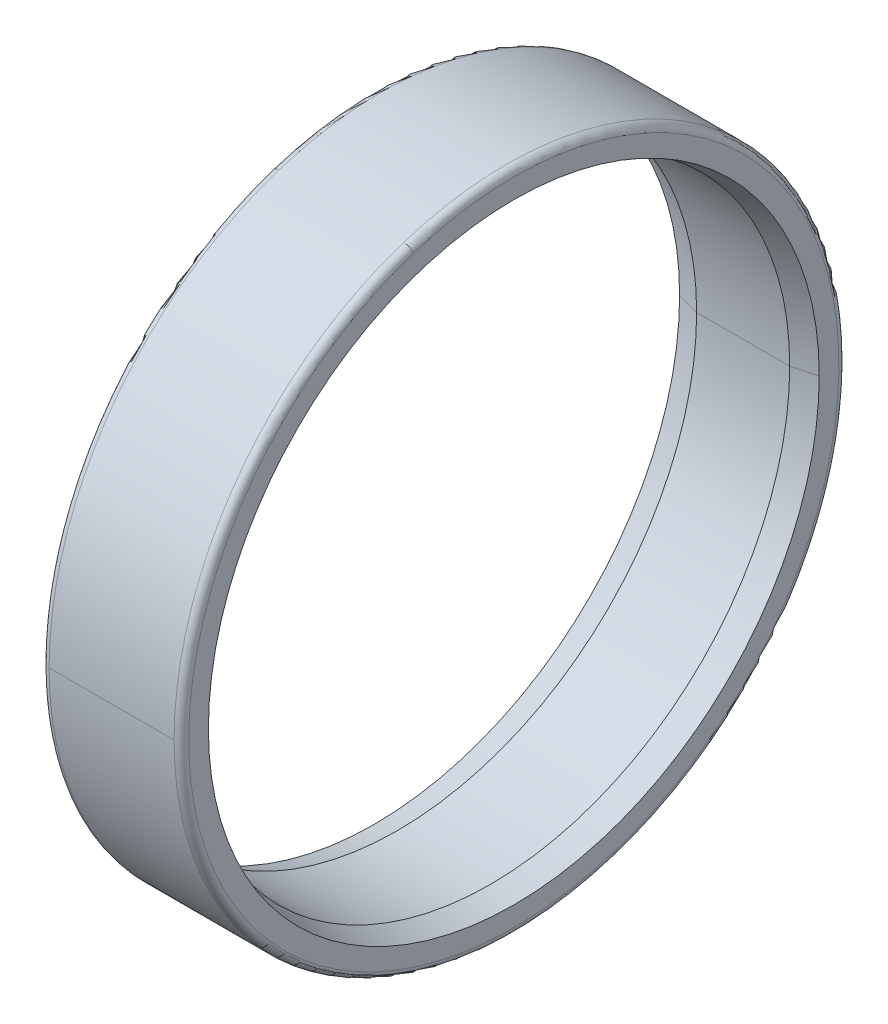
ISO-10303-21;
HEADER;
FILE_DESCRIPTION(('STEP AP214'),'2;1');
FILE_NAME('part.step','',(''),(''),'','','');
FILE_SCHEMA(('AUTOMOTIVE_DESIGN { 1 0 10303 214 1 1 1 1 }'));
ENDSEC;
DATA;
#1=APPLICATION_CONTEXT('core data for automotive mechanical design processes');
#2=APPLICATION_PROTOCOL_DEFINITION('international standard','automotive_design',2000,#1);
#3=PRODUCT_CONTEXT('',#1,'mechanical');
#4=PRODUCT('Part','Part','',(#3));
#5=PRODUCT_RELATED_PRODUCT_CATEGORY('part','',(#4));
#6=PRODUCT_DEFINITION_FORMATION('','',#4);
#7=PRODUCT_DEFINITION_CONTEXT('part definition',#1,'design');
#8=PRODUCT_DEFINITION('design','',#6,#7);
#9=PRODUCT_DEFINITION_SHAPE('','',#8);
#10=(LENGTH_UNIT() NAMED_UNIT(*) SI_UNIT(.MILLI.,.METRE.));
#11=(NAMED_UNIT(*) PLANE_ANGLE_UNIT() SI_UNIT($,.RADIAN.));
#12=(NAMED_UNIT(*) SI_UNIT($,.STERADIAN.) SOLID_ANGLE_UNIT());
#13=UNCERTAINTY_MEASURE_WITH_UNIT(LENGTH_MEASURE(1.E-05),#10,'distance_accuracy_value','');
#14=(GEOMETRIC_REPRESENTATION_CONTEXT(3) GLOBAL_UNCERTAINTY_ASSIGNED_CONTEXT((#13)) GLOBAL_UNIT_ASSIGNED_CONTEXT((#10,
#11,#12)) REPRESENTATION_CONTEXT('',''));
#15=CARTESIAN_POINT('',(0.,0.,0.));
#16=DIRECTION('',(0.,0.,1.));
#17=DIRECTION('',(1.,0.,0.));
#18=AXIS2_PLACEMENT_3D('',#15,#16,#17);
#19=CARTESIAN_POINT('',(0.,48.9,0.));
#20=DIRECTION('',(-1.,0.,0.));
#21=DIRECTION('',(0.,0.,1.));
#22=AXIS2_PLACEMENT_3D('',#19,#20,#21);
#23=PLANE('',#22);
#24=CARTESIAN_POINT('',(0.,0.,0.));
#25=DIRECTION('',(1.,0.,0.));
#26=DIRECTION('',(0.,0.,-1.));
#27=AXIS2_PLACEMENT_3D('',#24,#25,#26);
#28=CIRCLE('',#27,45.937822173509);
#29=CARTESIAN_POINT('',(0.,0.,-45.937822173509));
#30=VERTEX_POINT('',#29);
#31=CARTESIAN_POINT('',(0.,0.,45.937822173509));
#32=VERTEX_POINT('',#31);
#33=EDGE_CURVE('E11',#30,#32,#28,.T.);
#34=ORIENTED_EDGE('',*,*,#33,.T.);
#35=CARTESIAN_POINT('',(0.,0.,0.));
#36=DIRECTION('',(1.,0.,0.));
#37=DIRECTION('',(0.,0.,-1.));
#38=AXIS2_PLACEMENT_3D('',#35,#36,#37);
#39=CIRCLE('',#38,45.937822173509);
#40=EDGE_CURVE('E26',#32,#30,#39,.T.);
#41=ORIENTED_EDGE('',*,*,#40,.T.);
#42=EDGE_LOOP('',(#34,#41));
#43=FACE_BOUND('',#42,.T.);
#44=CARTESIAN_POINT('',(0.,46.506663646833,15.1109310249349));
#45=CARTESIAN_POINT('',(0.,46.2594275083766,15.8719005426773));
#46=CARTESIAN_POINT('',(0.,45.9934832526356,16.626789906107));
#47=CARTESIAN_POINT('',(0.,45.4248889301714,18.1226162391177));
#48=CARTESIAN_POINT('',(0.,45.1222388634484,18.8635532086987));
#49=CARTESIAN_POINT('',(0.,44.4809433426075,20.3296826687885));
#50=CARTESIAN_POINT('',(0.,44.1422978884898,21.0548751592974));
#51=CARTESIAN_POINT('',(0.,43.4298324265688,22.4877705123014));
#52=CARTESIAN_POINT('',(0.,43.0560124187656,23.1954733747965));
#53=CARTESIAN_POINT('',(0.,42.274097072954,24.5916840436056));
#54=CARTESIAN_POINT('',(0.,41.8660017349455,25.2801918499195));
#55=CARTESIAN_POINT('',(0.,41.0165192256346,26.6363538674045));
#56=CARTESIAN_POINT('',(0.,40.5751320543322,27.3040080785755));
#57=CARTESIAN_POINT('',(0.,39.660129122463,28.616854431685));
#58=CARTESIAN_POINT('',(0.,39.1865133618963,29.2620465736235));
#59=CARTESIAN_POINT('',(0.,38.2081942591603,30.5284144736971));
#60=CARTESIAN_POINT('',(0.,37.703490916991,31.1495902318321));
#61=CARTESIAN_POINT('',(0.,36.664212518692,32.3664288948598));
#62=CARTESIAN_POINT('',(0.,36.1296374625623,32.9620917997525));
#63=CARTESIAN_POINT('',(0.,35.0319034763291,34.1264697528883));
#64=CARTESIAN_POINT('',(0.,34.4687445462256,34.6951848011313));
#65=CARTESIAN_POINT('',(0.,33.3151995107377,35.8042969564141));
#66=CARTESIAN_POINT('',(0.,32.7248134053533,36.3446940634539));
#67=CARTESIAN_POINT('',(0.,31.5182363112762,37.3958684724169));
#68=CARTESIAN_POINT('',(0.,30.9020453225836,37.90664577434));
#69=CARTESIAN_POINT('',(0.,29.6453429199182,38.8973500657968));
#70=CARTESIAN_POINT('',(0.,29.0048315059454,39.3772770553306));
#71=CARTESIAN_POINT('',(0.,27.7010313008277,40.3051245358579));
#72=CARTESIAN_POINT('',(0.,27.0377425096827,40.7530450268514));
#73=CARTESIAN_POINT('',(0.,25.6899854710132,41.6158004306014));
#74=CARTESIAN_POINT('',(0.,25.0055172234886,42.0306353433578));
#75=CARTESIAN_POINT('',(0.,23.6170502160211,42.8262202169936));
#76=CARTESIAN_POINT('',(0.,22.9130514560782,43.206970177873));
#77=CARTESIAN_POINT('',(0.,21.4872194184496,43.9334678877493));
#78=CARTESIAN_POINT('',(0.,20.7653861407639,44.2792156367462));
#79=CARTESIAN_POINT('',(0.,19.3056240272408,44.9348759862461));
#80=CARTESIAN_POINT('',(0.,18.5676951914034,45.2447885867492));
#81=CARTESIAN_POINT('',(0.,17.0775196967775,45.8280320326618));
#82=CARTESIAN_POINT('',(0.,16.3252730379889,46.1013628780713));
#83=CARTESIAN_POINT('',(0.,14.8082741255506,46.6107843358492));
#84=CARTESIAN_POINT('',(0.,14.0435218719008,46.8468749482176));
#85=CARTESIAN_POINT('',(0.,12.5033541249036,47.2812471769491));
#86=CARTESIAN_POINT('',(0.,11.7279386315561,47.4795287933121));
#87=CARTESIAN_POINT('',(0.,10.1683124490052,47.8378053522515));
#88=CARTESIAN_POINT('',(0.,9.3841017598018,47.9978002948279));
#89=CARTESIAN_POINT('',(0.,7.80877441777818,48.2791180643635));
#90=CARTESIAN_POINT('',(0.,7.01765776495794,48.4004408913227));
#91=CARTESIAN_POINT('',(0.,5.4304243650109,48.6041221523071));
#92=CARTESIAN_POINT('',(0.,4.63430761788408,48.6864805863324));
#93=CARTESIAN_POINT('',(0.,3.03899194429929,48.8120346527676));
#94=CARTESIAN_POINT('',(0.,2.23979301784132,48.8552302851775));
#95=CARTESIAN_POINT('',(0.,0.640238325809615,48.9023546863202));
#96=CARTESIAN_POINT('',(0.,-0.160117439764109,48.9062834550529));
#97=CARTESIAN_POINT('',(0.,-1.76005768288518,48.8748646640931));
#98=CARTESIAN_POINT('',(0.,-2.55964216043252,48.8395171044005));
#99=CARTESIAN_POINT('',(0.,-4.15611355845907,48.7296308119576));
#100=CARTESIAN_POINT('',(0.,-4.95300047893828,48.6550920792072));
#101=CARTESIAN_POINT('',(0.,-6.54215699243808,48.4670030109846));
#102=CARTESIAN_POINT('',(0.,-7.33442658545868,48.3534526755124));
#103=CARTESIAN_POINT('',(0.,-8.91243979719704,48.08761395455));
#104=CARTESIAN_POINT('',(0.,-9.6981834159148,47.9353255690599));
#105=CARTESIAN_POINT('',(0.,-11.261251753847,47.5923776241214));
#106=CARTESIAN_POINT('',(0.,-12.0385764730614,47.401718064673));
#107=CARTESIAN_POINT('',(0.,-13.5829343686528,46.9824870873964));
#108=CARTESIAN_POINT('',(0.,-14.3499675450297,46.7539156695682));
#109=CARTESIAN_POINT('',(0.,-15.87189450484,46.2594116240979));
#110=CARTESIAN_POINT('',(0.,-16.6267882882733,45.9934789964559));
#111=CARTESIAN_POINT('',(0.,-18.1226178569512,45.4248931863511));
#112=CARTESIAN_POINT('',(0.,-18.8635536421958,45.1222400038883));
#113=CARTESIAN_POINT('',(0.,-20.3296822352912,44.4809422021677));
#114=CARTESIAN_POINT('',(0.,-21.0548750431421,44.1422975829099));
#115=CARTESIAN_POINT('',(0.,-22.4877706284565,43.4298327321488));
#116=CARTESIAN_POINT('',(0.,-23.1954734059202,43.0560125006456));
#117=CARTESIAN_POINT('',(0.,-24.5916840124818,42.2740969910741));
#118=CARTESIAN_POINT('',(0.,-25.2801918415799,41.8660017130059));
#119=CARTESIAN_POINT('',(0.,-26.6363538757439,41.0165192475743));
#120=CARTESIAN_POINT('',(0.,-27.30400808081,40.575132060211));
#121=CARTESIAN_POINT('',(0.,-28.6168544294503,39.6601291165844));
#122=CARTESIAN_POINT('',(0.,-29.2620465730247,39.1865133603212));
#123=CARTESIAN_POINT('',(0.,-30.5284144742958,38.2081942607355));
#124=CARTESIAN_POINT('',(0.,-31.1495902319925,37.7034909174131));
#125=CARTESIAN_POINT('',(0.,-32.3664288946993,36.66421251827));
#126=CARTESIAN_POINT('',(0.,-32.9620917997095,36.1296374624493));
#127=CARTESIAN_POINT('',(0.,-34.1264697529312,35.0319034764423));
#128=CARTESIAN_POINT('',(0.,-34.6951848011427,34.468744546256));
#129=CARTESIAN_POINT('',(0.,-35.8042969564025,33.3151995107074));
#130=CARTESIAN_POINT('',(0.,-36.3446940634508,32.7248134053452));
#131=CARTESIAN_POINT('',(0.,-37.3958684724199,31.5182363112844));
#132=CARTESIAN_POINT('',(0.,-37.9066457743408,30.9020453225859));
#133=CARTESIAN_POINT('',(0.,-38.8973500657959,29.6453429199161));
#134=CARTESIAN_POINT('',(0.,-39.3772770553303,29.0048315059449));
#135=CARTESIAN_POINT('',(0.,-40.305124535858,27.7010313008283));
#136=CARTESIAN_POINT('',(0.,-40.7530450268514,27.0377425096829));
#137=CARTESIAN_POINT('',(0.,-41.6158004306012,25.6899854710131));
#138=CARTESIAN_POINT('',(0.,-42.0306353433577,25.0055172234886));
#139=CARTESIAN_POINT('',(0.,-42.8262202169936,23.6170502160212));
#140=CARTESIAN_POINT('',(0.,-43.206970177873,22.9130514560783));
#141=CARTESIAN_POINT('',(0.,-43.9334678877493,21.4872194184497));
#142=CARTESIAN_POINT('',(0.,-44.2792156367461,20.765386140764));
#143=CARTESIAN_POINT('',(0.,-44.9348759862461,19.3056240272409));
#144=CARTESIAN_POINT('',(0.,-45.2447885867493,18.5676951914035));
#145=CARTESIAN_POINT('',(0.,-45.8280320326616,17.0775196967776));
#146=CARTESIAN_POINT('',(0.,-46.1013628780706,16.3252730379892));
#147=CARTESIAN_POINT('',(0.,-46.6107843358498,14.8082741255505));
#148=CARTESIAN_POINT('',(0.,-46.8468749482198,14.0435218719003));
#149=CARTESIAN_POINT('',(0.,-47.2812471769468,12.5033541249043));
#150=CARTESIAN_POINT('',(0.,-47.4795287933037,11.7279386315584));
#151=CARTESIAN_POINT('',(0.,-47.8378053522599,10.168312449003));
#152=CARTESIAN_POINT('',(0.,-47.9978002948592,9.38410175979341));
#153=CARTESIAN_POINT('',(0.,-48.2791180643322,7.80877441778678));
#154=CARTESIAN_POINT('',(0.,-48.4004408912059,7.01765776498976));
#155=CARTESIAN_POINT('',(0.,-48.6041221524239,5.43042436497932));
#156=CARTESIAN_POINT('',(0.,-48.6864805867681,4.63430761776589));
#157=CARTESIAN_POINT('',(0.,-48.8120346523318,3.03899194441768));
#158=CARTESIAN_POINT('',(0.,-48.8552302835512,2.23979301828289));
#159=CARTESIAN_POINT('',(0.,-48.9023546879465,0.640238325368244));
#160=CARTESIAN_POINT('',(0.,-48.9062834611223,-0.160117441411617));
#161=CARTESIAN_POINT('',(0.,-48.8748646580236,-1.76005768123747));
#162=CARTESIAN_POINT('',(0.,-48.8395170817491,-2.55964215428347));
#163=CARTESIAN_POINT('',(0.,-48.729630834609,-4.15611356460791));
#164=CARTESIAN_POINT('',(0.,-48.6550921637435,-4.95300050188636));
#165=CARTESIAN_POINT('',(0.,-48.4670029264483,-6.54215696948977));
#166=CARTESIAN_POINT('',(0.,-48.3534523600187,-7.33442649981472));
#167=CARTESIAN_POINT('',(0.,-48.0876142700437,-8.91243988284074));
#168=CARTESIAN_POINT('',(0.,-47.9353267464985,-9.69818373554182));
#169=CARTESIAN_POINT('',(0.,-47.5923764466829,-11.2612514342197));
#170=CARTESIAN_POINT('',(0.,-47.4017136704126,-12.0385752801966));
#171=CARTESIAN_POINT('',(0.,-46.9824914816568,-13.5829355615174));
#172=CARTESIAN_POINT('',(0.,-46.7539320691713,-14.3499719968614));
#173=CARTESIAN_POINT('',(0.,-46.5066636468331,-15.1109310249348));
#174=B_SPLINE_CURVE_WITH_KNOTS('',3,(#44,#45,#46,#47,#48,#49,#50,#51,#52,#53,#54,#55,#56,#57,
#58,#59,#60,#61,#62,#63,#64,#65,#66,#67,#68,#69,#70,#71,#72,#73,#74,#75,#76,#77,#78,#79,#80,#81,
#82,#83,#84,#85,#86,#87,#88,#89,#90,#91,#92,#93,#94,#95,#96,#97,#98,#99,#100,#101,#102,#103,
#104,#105,#106,#107,#108,#109,#110,#111,#112,#113,#114,#115,#116,#117,#118,#119,#120,#121,#122,
#123,#124,#125,#126,#127,#128,#129,#130,#131,#132,#133,#134,#135,#136,#137,#138,#139,#140,#141,
#142,#143,#144,#145,#146,#147,#148,#149,#150,#151,#152,#153,#154,#155,#156,#157,#158,#159,#160,
#161,#162,#163,#164,#165,#166,#167,#168,#169,#170,#171,#172,#173),.UNSPECIFIED.,.F.,.F.,(4,2,2,
2,2,2,2,2,2,2,2,2,2,2,2,2,2,2,2,2,2,2,2,2,2,2,2,2,2,2,2,2,2,2,2,2,2,2,2,2,2,2,2,2,2,2,2,2,2,2,2,
2,2,2,2,2,2,2,2,2,2,2,2,2,4),(0.,2.40013214954082,4.80026429908164,7.20039644862246,
9.60052859816327,12.0006607477041,14.4007928972449,16.8009250467857,19.2010571963266,
21.6011893458674,24.0013214954082,26.401453644949,28.8015857944898,31.2017179440306,
33.6018500935715,36.0019822431123,38.4021143926531,40.8022465421939,43.2023786917348,
45.6025108412756,48.0026429908164,50.4027751403572,52.802907289898,55.2030394394388,
57.6031715889797,60.0033037385205,62.4034358880613,64.8035680376021,67.2037001871429,
69.6038323366838,72.0039644862246,74.4040966357654,76.8042287853062,79.204360934847,
81.6044930843878,84.0046252339286,86.4047573834695,88.8048895330103,91.2050216825511,
93.6051538320919,96.0052859816328,98.4054181311736,100.805550280714,103.205682430255,
105.605814579796,108.005946729337,110.406078878878,112.806211028418,115.206343177959,
117.6064753275,120.006607477041,122.406739626582,124.806871776123,127.207003925663,
129.607136075204,132.007268224745,134.407400374286,136.807532523827,139.207664673368,
141.607796822908,144.007928972449,146.40806112199,148.808193271531,151.208325421072,
153.608457570612),.UNSPECIFIED.);
#175=CARTESIAN_POINT('',(0.,46.506663646833,15.1109310249349));
#176=VERTEX_POINT('',#175);
#177=CARTESIAN_POINT('',(0.,-46.506663646833,-15.1109310249349));
#178=VERTEX_POINT('',#177);
#179=EDGE_CURVE('E213',#176,#178,#174,.T.);
#180=ORIENTED_EDGE('',*,*,#179,.F.);
#181=CARTESIAN_POINT('',(0.,-46.506663646833,-15.1109310249349));
#182=CARTESIAN_POINT('',(0.,-46.2594275083766,-15.8719005426773));
#183=CARTESIAN_POINT('',(0.,-45.9934832526356,-16.626789906107));
#184=CARTESIAN_POINT('',(0.,-45.4248889301714,-18.1226162391177));
#185=CARTESIAN_POINT('',(0.,-45.1222388634484,-18.8635532086987));
#186=CARTESIAN_POINT('',(0.,-44.4809433426075,-20.3296826687885));
#187=CARTESIAN_POINT('',(0.,-44.1422978884898,-21.0548751592974));
#188=CARTESIAN_POINT('',(0.,-43.4298324265688,-22.4877705123014));
#189=CARTESIAN_POINT('',(0.,-43.0560124187656,-23.1954733747965));
#190=CARTESIAN_POINT('',(0.,-42.274097072954,-24.5916840436056));
#191=CARTESIAN_POINT('',(0.,-41.8660017349455,-25.2801918499195));
#192=CARTESIAN_POINT('',(0.,-41.0165192256346,-26.6363538674044));
#193=CARTESIAN_POINT('',(0.,-40.5751320543322,-27.3040080785754));
#194=CARTESIAN_POINT('',(0.,-39.6601291224631,-28.616854431685));
#195=CARTESIAN_POINT('',(0.,-39.1865133618963,-29.2620465736235));
#196=CARTESIAN_POINT('',(0.,-38.2081942591603,-30.5284144736971));
#197=CARTESIAN_POINT('',(0.,-37.703490916991,-31.1495902318321));
#198=CARTESIAN_POINT('',(0.,-36.6642125186921,-32.3664288948598));
#199=CARTESIAN_POINT('',(0.,-36.1296374625624,-32.9620917997525));
#200=CARTESIAN_POINT('',(0.,-35.0319034763291,-34.1264697528883));
#201=CARTESIAN_POINT('',(0.,-34.4687445462256,-34.6951848011313));
#202=CARTESIAN_POINT('',(0.,-33.3151995107377,-35.8042969564141));
#203=CARTESIAN_POINT('',(0.,-32.7248134053533,-36.3446940634539));
#204=CARTESIAN_POINT('',(0.,-31.5182363112763,-37.3958684724168));
#205=CARTESIAN_POINT('',(0.,-30.9020453225836,-37.90664577434));
#206=CARTESIAN_POINT('',(0.,-29.6453429199182,-38.8973500657968));
#207=CARTESIAN_POINT('',(0.,-29.0048315059455,-39.3772770553305));
#208=CARTESIAN_POINT('',(0.,-27.7010313008277,-40.3051245358578));
#209=CARTESIAN_POINT('',(0.,-27.0377425096828,-40.7530450268514));
#210=CARTESIAN_POINT('',(0.,-25.6899854710132,-41.6158004306013));
#211=CARTESIAN_POINT('',(0.,-25.0055172234886,-42.0306353433578));
#212=CARTESIAN_POINT('',(0.,-23.6170502160211,-42.8262202169936));
#213=CARTESIAN_POINT('',(0.,-22.9130514560782,-43.206970177873));
#214=CARTESIAN_POINT('',(0.,-21.4872194184496,-43.9334678877493));
#215=CARTESIAN_POINT('',(0.,-20.7653861407639,-44.2792156367462));
#216=CARTESIAN_POINT('',(0.,-19.3056240272408,-44.9348759862461));
#217=CARTESIAN_POINT('',(0.,-18.5676951914035,-45.2447885867492));
#218=CARTESIAN_POINT('',(0.,-17.0775196967775,-45.8280320326618));
#219=CARTESIAN_POINT('',(0.,-16.3252730379889,-46.1013628780713));
#220=CARTESIAN_POINT('',(0.,-14.8082741255506,-46.6107843358492));
#221=CARTESIAN_POINT('',(0.,-14.0435218719008,-46.8468749482176));
#222=CARTESIAN_POINT('',(0.,-12.5033541249036,-47.2812471769491));
#223=CARTESIAN_POINT('',(0.,-11.7279386315561,-47.4795287933121));
#224=CARTESIAN_POINT('',(0.,-10.1683124490052,-47.8378053522515));
#225=CARTESIAN_POINT('',(0.,-9.38410175980185,-47.9978002948279));
#226=CARTESIAN_POINT('',(0.,-7.80877441777823,-48.2791180643635));
#227=CARTESIAN_POINT('',(0.,-7.01765776495799,-48.4004408913227));
#228=CARTESIAN_POINT('',(0.,-5.43042436501094,-48.6041221523071));
#229=CARTESIAN_POINT('',(0.,-4.63430761788413,-48.6864805863324));
#230=CARTESIAN_POINT('',(0.,-3.03899194429934,-48.8120346527675));
#231=CARTESIAN_POINT('',(0.,-2.23979301784136,-48.8552302851775));
#232=CARTESIAN_POINT('',(0.,-0.640238325809655,-48.9023546863202));
#233=CARTESIAN_POINT('',(0.,0.160117439764075,-48.9062834550529));
#234=CARTESIAN_POINT('',(0.,1.76005768288514,-48.8748646640931));
#235=CARTESIAN_POINT('',(0.,2.55964216043248,-48.8395171044005));
#236=CARTESIAN_POINT('',(0.,4.15611355845903,-48.7296308119576));
#237=CARTESIAN_POINT('',(0.,4.95300047893823,-48.6550920792072));
#238=CARTESIAN_POINT('',(0.,6.54215699243802,-48.4670030109846));
#239=CARTESIAN_POINT('',(0.,7.3344265854586,-48.3534526755124));
#240=CARTESIAN_POINT('',(0.,8.91243979719696,-48.08761395455));
#241=CARTESIAN_POINT('',(0.,9.69818341591474,-47.9353255690599));
#242=CARTESIAN_POINT('',(0.,11.261251753847,-47.5923776241214));
#243=CARTESIAN_POINT('',(0.,12.0385764730614,-47.401718064673));
#244=CARTESIAN_POINT('',(0.,13.5829343686527,-46.9824870873964));
#245=CARTESIAN_POINT('',(0.,14.3499675450297,-46.7539156695682));
#246=CARTESIAN_POINT('',(0.,15.8718945048399,-46.2594116240979));
#247=CARTESIAN_POINT('',(0.,16.6267882882733,-45.993478996456));
#248=CARTESIAN_POINT('',(0.,18.1226178569512,-45.4248931863511));
#249=CARTESIAN_POINT('',(0.,18.8635536421957,-45.1222400038883));
#250=CARTESIAN_POINT('',(0.,20.3296822352912,-44.4809422021677));
#251=CARTESIAN_POINT('',(0.,21.054875043142,-44.1422975829099));
#252=CARTESIAN_POINT('',(0.,22.4877706284565,-43.4298327321488));
#253=CARTESIAN_POINT('',(0.,23.1954734059201,-43.0560125006456));
#254=CARTESIAN_POINT('',(0.,24.5916840124818,-42.2740969910741));
#255=CARTESIAN_POINT('',(0.,25.2801918415798,-41.8660017130059));
#256=CARTESIAN_POINT('',(0.,26.6363538757439,-41.0165192475744));
#257=CARTESIAN_POINT('',(0.,27.3040080808099,-40.575132060211));
#258=CARTESIAN_POINT('',(0.,28.6168544294503,-39.6601291165844));
#259=CARTESIAN_POINT('',(0.,29.2620465730247,-39.1865133603212));
#260=CARTESIAN_POINT('',(0.,30.5284144742957,-38.2081942607356));
#261=CARTESIAN_POINT('',(0.,31.1495902319924,-37.7034909174132));
#262=CARTESIAN_POINT('',(0.,32.3664288946993,-36.6642125182701));
#263=CARTESIAN_POINT('',(0.,32.9620917997094,-36.1296374624494));
#264=CARTESIAN_POINT('',(0.,34.1264697529311,-35.0319034764423));
#265=CARTESIAN_POINT('',(0.,34.6951848011427,-34.468744546256));
#266=CARTESIAN_POINT('',(0.,35.8042969564025,-33.3151995107075));
#267=CARTESIAN_POINT('',(0.,36.3446940634507,-32.7248134053453));
#268=CARTESIAN_POINT('',(0.,37.3958684724198,-31.5182363112845));
#269=CARTESIAN_POINT('',(0.,37.9066457743407,-30.9020453225859));
#270=CARTESIAN_POINT('',(0.,38.8973500657959,-29.6453429199162));
#271=CARTESIAN_POINT('',(0.,39.3772770553302,-29.004831505945));
#272=CARTESIAN_POINT('',(0.,40.305124535858,-27.7010313008284));
#273=CARTESIAN_POINT('',(0.,40.7530450268514,-27.037742509683));
#274=CARTESIAN_POINT('',(0.,41.6158004306012,-25.6899854710132));
#275=CARTESIAN_POINT('',(0.,42.0306353433577,-25.0055172234887));
#276=CARTESIAN_POINT('',(0.,42.8262202169935,-23.6170502160213));
#277=CARTESIAN_POINT('',(0.,43.2069701778729,-22.9130514560783));
#278=CARTESIAN_POINT('',(0.,43.9334678877492,-21.4872194184497));
#279=CARTESIAN_POINT('',(0.,44.2792156367461,-20.765386140764));
#280=CARTESIAN_POINT('',(0.,44.9348759862461,-19.3056240272409));
#281=CARTESIAN_POINT('',(0.,45.2447885867493,-18.5676951914035));
#282=CARTESIAN_POINT('',(0.,45.8280320326615,-17.0775196967777));
#283=CARTESIAN_POINT('',(0.,46.1013628780706,-16.3252730379892));
#284=CARTESIAN_POINT('',(0.,46.6107843358497,-14.8082741255505));
#285=CARTESIAN_POINT('',(0.,46.8468749482198,-14.0435218719004));
#286=CARTESIAN_POINT('',(0.,47.2812471769468,-12.5033541249043));
#287=CARTESIAN_POINT('',(0.,47.4795287933037,-11.7279386315585));
#288=CARTESIAN_POINT('',(0.,47.8378053522598,-10.1683124490031));
#289=CARTESIAN_POINT('',(0.,47.9978002948591,-9.38410175979348));
#290=CARTESIAN_POINT('',(0.,48.2791180643322,-7.80877441778685));
#291=CARTESIAN_POINT('',(0.,48.4004408912059,-7.01765776498982));
#292=CARTESIAN_POINT('',(0.,48.6041221524239,-5.43042436497938));
#293=CARTESIAN_POINT('',(0.,48.6864805867681,-4.63430761776597));
#294=CARTESIAN_POINT('',(0.,48.8120346523318,-3.03899194441777));
#295=CARTESIAN_POINT('',(0.,48.8552302835512,-2.23979301828299));
#296=CARTESIAN_POINT('',(0.,48.9023546879465,-0.640238325368338));
#297=CARTESIAN_POINT('',(0.,48.9062834611223,0.160117441411524));
#298=CARTESIAN_POINT('',(0.,48.8748646580236,1.76005768123738));
#299=CARTESIAN_POINT('',(0.,48.8395170817491,2.55964215428337));
#300=CARTESIAN_POINT('',(0.,48.7296308346091,4.15611356460782));
#301=CARTESIAN_POINT('',(0.,48.6550921637435,4.95300050188627));
#302=CARTESIAN_POINT('',(0.,48.4670029264483,6.54215696948969));
#303=CARTESIAN_POINT('',(0.,48.3534523600187,7.33442649981466));
#304=CARTESIAN_POINT('',(0.,48.0876142700438,8.91243988284069));
#305=CARTESIAN_POINT('',(0.,47.9353267464985,9.69818373554177));
#306=CARTESIAN_POINT('',(0.,47.5923764466829,11.2612514342197));
#307=CARTESIAN_POINT('',(0.,47.4017136704126,12.0385752801965));
#308=CARTESIAN_POINT('',(0.,46.9824914816568,13.5829355615174));
#309=CARTESIAN_POINT('',(0.,46.7539320691713,14.3499719968614));
#310=CARTESIAN_POINT('',(0.,46.5066636468331,15.1109310249347));
#311=B_SPLINE_CURVE_WITH_KNOTS('',3,(#181,#182,#183,#184,#185,#186,#187,#188,#189,#190,#191,
#192,#193,#194,#195,#196,#197,#198,#199,#200,#201,#202,#203,#204,#205,#206,#207,#208,#209,#210,
#211,#212,#213,#214,#215,#216,#217,#218,#219,#220,#221,#222,#223,#224,#225,#226,#227,#228,#229,
#230,#231,#232,#233,#234,#235,#236,#237,#238,#239,#240,#241,#242,#243,#244,#245,#246,#247,#248,
#249,#250,#251,#252,#253,#254,#255,#256,#257,#258,#259,#260,#261,#262,#263,#264,#265,#266,#267,
#268,#269,#270,#271,#272,#273,#274,#275,#276,#277,#278,#279,#280,#281,#282,#283,#284,#285,#286,
#287,#288,#289,#290,#291,#292,#293,#294,#295,#296,#297,#298,#299,#300,#301,#302,#303,#304,#305,
#306,#307,#308,#309,#310),.UNSPECIFIED.,.F.,.F.,(4,2,2,2,2,2,2,2,2,2,2,2,2,2,2,2,2,2,2,2,2,2,2,
2,2,2,2,2,2,2,2,2,2,2,2,2,2,2,2,2,2,2,2,2,2,2,2,2,2,2,2,2,2,2,2,2,2,2,2,2,2,2,2,2,4),(0.,
2.40013214954082,4.80026429908163,7.20039644862245,9.60052859816327,12.0006607477041,
14.4007928972449,16.8009250467857,19.2010571963265,21.6011893458674,24.0013214954082,
26.401453644949,28.8015857944898,31.2017179440306,33.6018500935714,36.0019822431122,
38.4021143926531,40.8022465421939,43.2023786917347,45.6025108412755,48.0026429908164,
50.4027751403572,52.802907289898,55.2030394394388,57.6031715889796,60.0033037385204,
62.4034358880613,64.8035680376021,67.2037001871429,69.6038323366837,72.0039644862245,
74.4040966357654,76.8042287853062,79.204360934847,81.6044930843878,84.0046252339286,
86.4047573834694,88.8048895330103,91.2050216825511,93.6051538320919,96.0052859816327,
98.4054181311735,100.805550280714,103.205682430255,105.605814579796,108.005946729337,
110.406078878878,112.806211028418,115.206343177959,117.6064753275,120.006607477041,
122.406739626582,124.806871776123,127.207003925663,129.607136075204,132.007268224745,
134.407400374286,136.807532523827,139.207664673367,141.607796822908,144.007928972449,
146.40806112199,148.808193271531,151.208325421072,153.608457570612),.UNSPECIFIED.);
#312=EDGE_CURVE('E314',#178,#176,#311,.T.);
#313=ORIENTED_EDGE('',*,*,#312,.F.);
#314=EDGE_LOOP('',(#180,#313));
#315=FACE_BOUND('',#314,.T.);
#316=ADVANCED_FACE('F17',(#43,#315),#23,.T.);
#317=CARTESIAN_POINT('',(1.10000000000036,0.,0.));
#318=DIRECTION('',(1.,0.,0.));
#319=DIRECTION('',(0.,-0.309016994374947,0.951056516295154));
#320=AXIS2_PLACEMENT_3D('',#317,#318,#319);
#321=TOROIDAL_SURFACE('',#320,48.9,1.10000000000036);
#322=CARTESIAN_POINT('',(1.10000000000036,-46.506663646833,-15.1109310249349));
#323=DIRECTION('',(0.,0.309016994374947,-0.951056516295154));
#324=DIRECTION('',(-3.30039026411189E-13,-0.951056516295154,-0.309016994374947));
#325=AXIS2_PLACEMENT_3D('',#322,#323,#324);
#326=CIRCLE('',#325,1.10000000000036);
#327=CARTESIAN_POINT('',(1.1,-47.552825814758,-15.4508497187475));
#328=VERTEX_POINT('',#327);
#329=EDGE_CURVE('E277',#328,#178,#326,.T.);
#330=ORIENTED_EDGE('',*,*,#329,.T.);
#331=ORIENTED_EDGE('',*,*,#312,.T.);
#332=CARTESIAN_POINT('',(1.10000000000036,46.506663646833,15.1109310249349));
#333=DIRECTION('',(0.,-0.309016994374947,0.951056516295154));
#334=DIRECTION('',(-3.29029732752439E-13,0.951056516295154,0.309016994374947));
#335=AXIS2_PLACEMENT_3D('',#332,#333,#334);
#336=CIRCLE('',#335,1.10000000000036);
#337=CARTESIAN_POINT('',(1.1,47.552825814758,15.4508497187475));
#338=VERTEX_POINT('',#337);
#339=EDGE_CURVE('E273',#338,#176,#336,.T.);
#340=ORIENTED_EDGE('',*,*,#339,.F.);
#341=CARTESIAN_POINT('',(1.1,0.,0.));
#342=DIRECTION('',(1.,0.,0.));
#343=DIRECTION('',(0.,0.,-1.));
#344=AXIS2_PLACEMENT_3D('',#341,#342,#343);
#345=CIRCLE('',#344,50.);
#346=CARTESIAN_POINT('',(1.1,0.,-50.));
#347=VERTEX_POINT('',#346);
#348=EDGE_CURVE('E268',#347,#338,#345,.T.);
#349=ORIENTED_EDGE('',*,*,#348,.F.);
#350=CARTESIAN_POINT('',(1.1,0.,0.));
#351=DIRECTION('',(1.,0.,0.));
#352=DIRECTION('',(0.,0.,-1.));
#353=AXIS2_PLACEMENT_3D('',#350,#351,#352);
#354=CIRCLE('',#353,50.);
#355=EDGE_CURVE('E263',#328,#347,#354,.T.);
#356=ORIENTED_EDGE('',*,*,#355,.F.);
#357=EDGE_LOOP('',(#330,#331,#340,#349,#356));
#358=FACE_BOUND('',#357,.T.);
#359=ADVANCED_FACE('F285',(#358),#321,.T.);
#360=CARTESIAN_POINT('',(10.5,0.,0.));
#361=DIRECTION('',(1.,0.,0.));
#362=DIRECTION('',(0.,1.,0.));
#363=AXIS2_PLACEMENT_3D('',#360,#361,#362);
#364=CYLINDRICAL_SURFACE('',#363,50.);
#365=DIRECTION('',(1.,0.,0.));
#366=VECTOR('',#365,1.);
#367=CARTESIAN_POINT('',(1.09999999999999,0.,50.));
#368=LINE('',#367,#366);
#369=CARTESIAN_POINT('',(1.09999999999999,0.,50.));
#370=VERTEX_POINT('',#369);
#371=CARTESIAN_POINT('',(19.9,0.,50.));
#372=VERTEX_POINT('',#371);
#373=EDGE_CURVE('E258',#370,#372,#368,.T.);
#374=ORIENTED_EDGE('',*,*,#373,.F.);
#375=CARTESIAN_POINT('',(1.1,0.,0.));
#376=DIRECTION('',(1.,0.,0.));
#377=DIRECTION('',(0.,0.,-1.));
#378=AXIS2_PLACEMENT_3D('',#375,#376,#377);
#379=CIRCLE('',#378,50.);
#380=EDGE_CURVE('E253',#370,#328,#379,.T.);
#381=ORIENTED_EDGE('',*,*,#380,.T.);
#382=ORIENTED_EDGE('',*,*,#355,.T.);
#383=DIRECTION('',(1.,0.,0.));
#384=VECTOR('',#383,1.);
#385=CARTESIAN_POINT('',(1.1,0.,-50.));
#386=LINE('',#385,#384);
#387=CARTESIAN_POINT('',(19.9,0.,-50.));
#388=VERTEX_POINT('',#387);
#389=EDGE_CURVE('E249',#347,#388,#386,.T.);
#390=ORIENTED_EDGE('',*,*,#389,.T.);
#391=CARTESIAN_POINT('',(19.9,0.,0.));
#392=DIRECTION('',(1.,0.,0.));
#393=DIRECTION('',(0.,0.,-1.));
#394=AXIS2_PLACEMENT_3D('',#391,#392,#393);
#395=CIRCLE('',#394,50.);
#396=CARTESIAN_POINT('',(19.9,-47.5528258147577,-15.4508497187474));
#397=VERTEX_POINT('',#396);
#398=EDGE_CURVE('E244',#397,#388,#395,.T.);
#399=ORIENTED_EDGE('',*,*,#398,.F.);
#400=CARTESIAN_POINT('',(19.9,0.,0.));
#401=DIRECTION('',(1.,0.,0.));
#402=DIRECTION('',(0.,0.,-1.));
#403=AXIS2_PLACEMENT_3D('',#400,#401,#402);
#404=CIRCLE('',#403,50.);
#405=EDGE_CURVE('E239',#372,#397,#404,.T.);
#406=ORIENTED_EDGE('',*,*,#405,.F.);
#407=EDGE_LOOP('',(#374,#381,#382,#390,#399,#406));
#408=FACE_BOUND('',#407,.T.);
#409=ADVANCED_FACE('F294',(#408),#364,.T.);
#410=CARTESIAN_POINT('',(19.8999999999993,0.,0.));
#411=DIRECTION('',(1.,0.,0.));
#412=DIRECTION('',(0.,0.309016994374947,-0.951056516295154));
#413=AXIS2_PLACEMENT_3D('',#410,#411,#412);
#414=TOROIDAL_SURFACE('',#413,48.8999999999993,1.1000000000007);
#415=CARTESIAN_POINT('',(19.8999999999993,-46.5066636468323,-15.1109310249347));
#416=DIRECTION('',(0.,0.309016994374947,-0.951056516295154));
#417=DIRECTION('',(1.,0.,0.));
#418=AXIS2_PLACEMENT_3D('',#415,#416,#417);
#419=CIRCLE('',#418,1.1000000000007);
#420=CARTESIAN_POINT('',(21.,-46.5066636468323,-15.1109310249347));
#421=VERTEX_POINT('',#420);
#422=EDGE_CURVE('E235',#421,#397,#419,.T.);
#423=ORIENTED_EDGE('',*,*,#422,.F.);
#424=CARTESIAN_POINT('',(21.,0.,0.));
#425=DIRECTION('',(1.,0.,0.));
#426=DIRECTION('',(0.,0.,-1.));
#427=AXIS2_PLACEMENT_3D('',#424,#425,#426);
#428=CIRCLE('',#427,48.9);
#429=CARTESIAN_POINT('',(21.,46.5066636468323,15.1109310249347));
#430=VERTEX_POINT('',#429);
#431=EDGE_CURVE('E231',#430,#421,#428,.T.);
#432=ORIENTED_EDGE('',*,*,#431,.F.);
#433=CARTESIAN_POINT('',(19.8999999999993,46.5066636468323,15.1109310249347));
#434=DIRECTION('',(0.,-0.309016994374947,0.951056516295154));
#435=DIRECTION('',(1.,0.,0.));
#436=AXIS2_PLACEMENT_3D('',#433,#434,#435);
#437=CIRCLE('',#436,1.1000000000007);
#438=CARTESIAN_POINT('',(19.9,47.5528258147577,15.4508497187474));
#439=VERTEX_POINT('',#438);
#440=EDGE_CURVE('E227',#430,#439,#437,.T.);
#441=ORIENTED_EDGE('',*,*,#440,.T.);
#442=CARTESIAN_POINT('',(19.9,0.,0.));
#443=DIRECTION('',(1.,0.,0.));
#444=DIRECTION('',(0.,0.,-1.));
#445=AXIS2_PLACEMENT_3D('',#442,#443,#444);
#446=CIRCLE('',#445,50.);
#447=EDGE_CURVE('E222',#439,#372,#446,.T.);
#448=ORIENTED_EDGE('',*,*,#447,.T.);
#449=ORIENTED_EDGE('',*,*,#405,.T.);
#450=EDGE_LOOP('',(#423,#432,#441,#448,#449));
#451=FACE_BOUND('',#450,.T.);
#452=ADVANCED_FACE('F298',(#451),#414,.T.);
#453=CARTESIAN_POINT('',(10.5,0.,0.));
#454=DIRECTION('',(1.,0.,0.));
#455=DIRECTION('',(0.,-1.,0.));
#456=AXIS2_PLACEMENT_3D('',#453,#454,#455);
#457=CYLINDRICAL_SURFACE('',#456,50.);
#458=ORIENTED_EDGE('',*,*,#373,.T.);
#459=ORIENTED_EDGE('',*,*,#447,.F.);
#460=CARTESIAN_POINT('',(19.9,0.,0.));
#461=DIRECTION('',(1.,0.,0.));
#462=DIRECTION('',(0.,0.,-1.));
#463=AXIS2_PLACEMENT_3D('',#460,#461,#462);
#464=CIRCLE('',#463,50.);
#465=EDGE_CURVE('E217',#388,#439,#464,.T.);
#466=ORIENTED_EDGE('',*,*,#465,.F.);
#467=ORIENTED_EDGE('',*,*,#389,.F.);
#468=ORIENTED_EDGE('',*,*,#348,.T.);
#469=CARTESIAN_POINT('',(1.1,0.,0.));
#470=DIRECTION('',(1.,0.,0.));
#471=DIRECTION('',(0.,0.,-1.));
#472=AXIS2_PLACEMENT_3D('',#469,#470,#471);
#473=CIRCLE('',#472,50.);
#474=EDGE_CURVE('E214',#338,#370,#473,.T.);
#475=ORIENTED_EDGE('',*,*,#474,.T.);
#476=EDGE_LOOP('',(#458,#459,#466,#467,#468,#475));
#477=FACE_BOUND('',#476,.T.);
#478=ADVANCED_FACE('F301',(#477),#457,.T.);
#479=CARTESIAN_POINT('',(1.10000000000036,0.,0.));
#480=DIRECTION('',(1.,0.,0.));
#481=DIRECTION('',(0.,0.309016994374947,-0.951056516295154));
#482=AXIS2_PLACEMENT_3D('',#479,#480,#481);
#483=TOROIDAL_SURFACE('',#482,48.9,1.10000000000036);
#484=ORIENTED_EDGE('',*,*,#329,.F.);
#485=ORIENTED_EDGE('',*,*,#380,.F.);
#486=ORIENTED_EDGE('',*,*,#474,.F.);
#487=ORIENTED_EDGE('',*,*,#339,.T.);
#488=ORIENTED_EDGE('',*,*,#179,.T.);
#489=EDGE_LOOP('',(#484,#485,#486,#487,#488));
#490=FACE_BOUND('',#489,.T.);
#491=ADVANCED_FACE('F183',(#490),#483,.T.);
#492=CARTESIAN_POINT('',(19.8999999999993,0.,0.));
#493=DIRECTION('',(1.,0.,0.));
#494=DIRECTION('',(0.,-0.309016994374947,0.951056516295154));
#495=AXIS2_PLACEMENT_3D('',#492,#493,#494);
#496=TOROIDAL_SURFACE('',#495,48.8999999999993,1.1000000000007);
#497=ORIENTED_EDGE('',*,*,#422,.T.);
#498=ORIENTED_EDGE('',*,*,#398,.T.);
#499=ORIENTED_EDGE('',*,*,#465,.T.);
#500=ORIENTED_EDGE('',*,*,#440,.F.);
#501=CARTESIAN_POINT('',(21.,-46.506663646833,-15.1109310249349));
#502=CARTESIAN_POINT('',(21.,-44.13294774472,-22.4161123145812));
#503=CARTESIAN_POINT('',(21.,-40.3254536312113,-29.2556586001716));
#504=CARTESIAN_POINT('',(21.,-35.2035940344659,-35.2522625017673));
#505=CARTESIAN_POINT('',(21.,-22.8847087927393,-44.9137527565145));
#506=CARTESIAN_POINT('',(21.,-7.82753012911089,-49.2011081164484));
#507=CARTESIAN_POINT('',(21.,0.0344156827518649,-49.8198700774724));
#508=CARTESIAN_POINT('',(21.,15.5768831932708,-47.9407169644317));
#509=CARTESIAN_POINT('',(21.,29.2555420304461,-40.3253505809962));
#510=CARTESIAN_POINT('',(21.,35.2522906457284,-35.2036258365196));
#511=CARTESIAN_POINT('',(21.,44.9137598200376,-22.8846949297948));
#512=CARTESIAN_POINT('',(21.,49.2010658454411,-7.82752605294623));
#513=CARTESIAN_POINT('',(21.,49.8200219648135,0.0343819472596962));
#514=CARTESIAN_POINT('',(21.,48.8801649695824,7.8056800142269));
#515=CARTESIAN_POINT('',(21.,46.506663646833,15.1109310249349));
#516=B_SPLINE_CURVE_WITH_KNOTS('',5,(#501,#502,#503,#504,#505,#506,#507,#508,#509,#510,#511,
#512,#513,#514,#515),.UNSPECIFIED.,.F.,.F.,(6,3,3,3,6),(0.,0.785398163397448,1.5707963267949,
2.35619449019234,3.14159265358979),.UNSPECIFIED.);
#517=EDGE_CURVE('E157',#421,#430,#516,.T.);
#518=ORIENTED_EDGE('',*,*,#517,.F.);
#519=EDGE_LOOP('',(#497,#498,#499,#500,#518));
#520=FACE_BOUND('',#519,.T.);
#521=ADVANCED_FACE('F177',(#520),#496,.T.);
#522=CARTESIAN_POINT('',(21.,45.937822173509,0.));
#523=DIRECTION('',(1.,0.,0.));
#524=DIRECTION('',(0.,0.,-1.));
#525=AXIS2_PLACEMENT_3D('',#522,#523,#524);
#526=PLANE('',#525);
#527=ORIENTED_EDGE('',*,*,#431,.T.);
#528=ORIENTED_EDGE('',*,*,#517,.T.);
#529=EDGE_LOOP('',(#527,#528));
#530=FACE_BOUND('',#529,.T.);
#531=CARTESIAN_POINT('',(21.,0.,0.));
#532=DIRECTION('',(1.,0.,0.));
#533=DIRECTION('',(0.,0.,-1.));
#534=AXIS2_PLACEMENT_3D('',#531,#532,#533);
#535=CIRCLE('',#534,45.937822173509);
#536=CARTESIAN_POINT('',(21.,0.,45.937822173509));
#537=VERTEX_POINT('',#536);
#538=CARTESIAN_POINT('',(21.,0.,-45.937822173509));
#539=VERTEX_POINT('',#538);
#540=EDGE_CURVE('E152',#537,#539,#535,.T.);
#541=ORIENTED_EDGE('',*,*,#540,.F.);
#542=CARTESIAN_POINT('',(21.,0.,0.));
#543=DIRECTION('',(1.,0.,0.));
#544=DIRECTION('',(0.,0.,-1.));
#545=AXIS2_PLACEMENT_3D('',#542,#543,#544);
#546=CIRCLE('',#545,45.937822173509);
#547=EDGE_CURVE('E147',#539,#537,#546,.T.);
#548=ORIENTED_EDGE('',*,*,#547,.F.);
#549=EDGE_LOOP('',(#541,#548));
#550=FACE_BOUND('',#549,.T.);
#551=ADVANCED_FACE('F166',(#530,#550),#526,.T.);
#552=CARTESIAN_POINT('',(17.5,0.,0.));
#553=DIRECTION('',(1.,0.,0.));
#554=DIRECTION('',(0.,-1.,0.));
#555=AXIS2_PLACEMENT_3D('',#552,#553,#554);
#556=CONICAL_SURFACE('',#555,45.,0.261799387799169);
#557=DIRECTION('',(0.965925826289063,0.,0.25881904510254));
#558=VECTOR('',#557,1.);
#559=CARTESIAN_POINT('',(17.5,0.,45.));
#560=LINE('',#559,#558);
#561=CARTESIAN_POINT('',(17.5,0.,45.));
#562=VERTEX_POINT('',#561);
#563=EDGE_CURVE('E142',#562,#537,#560,.T.);
#564=ORIENTED_EDGE('',*,*,#563,.F.);
#565=CARTESIAN_POINT('',(17.5,0.,0.));
#566=DIRECTION('',(1.,0.,0.));
#567=DIRECTION('',(0.,0.,-1.));
#568=AXIS2_PLACEMENT_3D('',#565,#566,#567);
#569=CIRCLE('',#568,45.);
#570=CARTESIAN_POINT('',(17.5,0.,-45.));
#571=VERTEX_POINT('',#570);
#572=EDGE_CURVE('E108',#571,#562,#569,.T.);
#573=ORIENTED_EDGE('',*,*,#572,.F.);
#574=DIRECTION('',(0.965925826289063,0.,-0.25881904510254));
#575=VECTOR('',#574,1.);
#576=CARTESIAN_POINT('',(17.5,0.,-45.));
#577=LINE('',#576,#575);
#578=EDGE_CURVE('E134',#571,#539,#577,.T.);
#579=ORIENTED_EDGE('',*,*,#578,.T.);
#580=ORIENTED_EDGE('',*,*,#547,.T.);
#581=EDGE_LOOP('',(#564,#573,#579,#580));
#582=FACE_BOUND('',#581,.T.);
#583=ADVANCED_FACE('F176',(#582),#556,.F.);
#584=CARTESIAN_POINT('',(17.5,0.,0.));
#585=DIRECTION('',(1.,0.,0.));
#586=DIRECTION('',(0.,1.,0.));
#587=AXIS2_PLACEMENT_3D('',#584,#585,#586);
#588=CONICAL_SURFACE('',#587,45.,0.261799387799169);
#589=ORIENTED_EDGE('',*,*,#563,.T.);
#590=ORIENTED_EDGE('',*,*,#540,.T.);
#591=ORIENTED_EDGE('',*,*,#578,.F.);
#592=CARTESIAN_POINT('',(17.5,0.,0.));
#593=DIRECTION('',(1.,0.,0.));
#594=DIRECTION('',(0.,0.,-1.));
#595=AXIS2_PLACEMENT_3D('',#592,#593,#594);
#596=CIRCLE('',#595,45.);
#597=EDGE_CURVE('E109',#562,#571,#596,.T.);
#598=ORIENTED_EDGE('',*,*,#597,.F.);
#599=EDGE_LOOP('',(#589,#590,#591,#598));
#600=FACE_BOUND('',#599,.T.);
#601=ADVANCED_FACE('F345',(#600),#588,.F.);
#602=CARTESIAN_POINT('',(10.5,0.,0.));
#603=DIRECTION('',(1.,0.,0.));
#604=DIRECTION('',(0.,1.,0.));
#605=AXIS2_PLACEMENT_3D('',#602,#603,#604);
#606=CYLINDRICAL_SURFACE('',#605,45.);
#607=DIRECTION('',(1.,0.,0.));
#608=VECTOR('',#607,1.);
#609=CARTESIAN_POINT('',(3.5,0.,45.));
#610=LINE('',#609,#608);
#611=CARTESIAN_POINT('',(3.50000000000003,0.,45.));
#612=VERTEX_POINT('',#611);
#613=EDGE_CURVE('E93',#612,#562,#610,.T.);
#614=ORIENTED_EDGE('',*,*,#613,.T.);
#615=ORIENTED_EDGE('',*,*,#597,.T.);
#616=DIRECTION('',(1.,0.,0.));
#617=VECTOR('',#616,1.);
#618=CARTESIAN_POINT('',(3.5,0.,-45.));
#619=LINE('',#618,#617);
#620=CARTESIAN_POINT('',(3.5,0.,-45.));
#621=VERTEX_POINT('',#620);
#622=EDGE_CURVE('E96',#621,#571,#619,.T.);
#623=ORIENTED_EDGE('',*,*,#622,.F.);
#624=CARTESIAN_POINT('',(3.5,0.,0.));
#625=DIRECTION('',(1.,0.,0.));
#626=DIRECTION('',(0.,0.,-1.));
#627=AXIS2_PLACEMENT_3D('',#624,#625,#626);
#628=CIRCLE('',#627,45.);
#629=EDGE_CURVE('E89',#612,#621,#628,.T.);
#630=ORIENTED_EDGE('',*,*,#629,.F.);
#631=EDGE_LOOP('',(#614,#615,#623,#630));
#632=FACE_BOUND('',#631,.T.);
#633=ADVANCED_FACE('F91',(#632),#606,.F.);
#634=CARTESIAN_POINT('',(0.,0.,0.));
#635=DIRECTION('',(-1.,0.,0.));
#636=DIRECTION('',(0.,1.,0.));
#637=AXIS2_PLACEMENT_3D('',#634,#635,#636);
#638=CONICAL_SURFACE('',#637,45.937822173509,0.261799387799169);
#639=DIRECTION('',(-0.965925826289063,0.,-0.25881904510254));
#640=VECTOR('',#639,1.);
#641=CARTESIAN_POINT('',(3.50000000000003,0.,-45.));
#642=LINE('',#641,#640);
#643=EDGE_CURVE('E101',#621,#30,#642,.T.);
#644=ORIENTED_EDGE('',*,*,#643,.T.);
#645=ORIENTED_EDGE('',*,*,#40,.F.);
#646=DIRECTION('',(-0.965925826289063,0.,0.25881904510254));
#647=VECTOR('',#646,1.);
#648=CARTESIAN_POINT('',(3.50000000000003,0.,45.));
#649=LINE('',#648,#647);
#650=EDGE_CURVE('E114',#612,#32,#649,.T.);
#651=ORIENTED_EDGE('',*,*,#650,.F.);
#652=ORIENTED_EDGE('',*,*,#629,.T.);
#653=EDGE_LOOP('',(#644,#645,#651,#652));
#654=FACE_BOUND('',#653,.T.);
#655=ADVANCED_FACE('F116',(#654),#638,.F.);
#656=CARTESIAN_POINT('',(0.,0.,0.));
#657=DIRECTION('',(-1.,0.,0.));
#658=DIRECTION('',(0.,-1.,0.));
#659=AXIS2_PLACEMENT_3D('',#656,#657,#658);
#660=CONICAL_SURFACE('',#659,45.937822173509,0.261799387799169);
#661=ORIENTED_EDGE('',*,*,#643,.F.);
#662=CARTESIAN_POINT('',(3.5,0.,0.));
#663=DIRECTION('',(1.,0.,0.));
#664=DIRECTION('',(0.,0.,-1.));
#665=AXIS2_PLACEMENT_3D('',#662,#663,#664);
#666=CIRCLE('',#665,45.);
#667=EDGE_CURVE('E106',#621,#612,#666,.T.);
#668=ORIENTED_EDGE('',*,*,#667,.T.);
#669=ORIENTED_EDGE('',*,*,#650,.T.);
#670=ORIENTED_EDGE('',*,*,#33,.F.);
#671=EDGE_LOOP('',(#661,#668,#669,#670));
#672=FACE_BOUND('',#671,.T.);
#673=ADVANCED_FACE('F113',(#672),#660,.F.);
#674=CARTESIAN_POINT('',(10.5,0.,0.));
#675=DIRECTION('',(1.,0.,0.));
#676=DIRECTION('',(0.,-1.,0.));
#677=AXIS2_PLACEMENT_3D('',#674,#675,#676);
#678=CYLINDRICAL_SURFACE('',#677,45.);
#679=ORIENTED_EDGE('',*,*,#613,.F.);
#680=ORIENTED_EDGE('',*,*,#667,.F.);
#681=ORIENTED_EDGE('',*,*,#622,.T.);
#682=ORIENTED_EDGE('',*,*,#572,.T.);
#683=EDGE_LOOP('',(#679,#680,#681,#682));
#684=FACE_BOUND('',#683,.T.);
#685=ADVANCED_FACE('F105',(#684),#678,.F.);
#686=CLOSED_SHELL('',(#316,#359,#409,#452,#478,#491,#521,#551,#583,#601,#633,#655,#673,#685));
#687=MANIFOLD_SOLID_BREP('B1',#686);
#688=ADVANCED_BREP_SHAPE_REPRESENTATION('',(#18,#687),#14);
#689=SHAPE_DEFINITION_REPRESENTATION(#9,#688);
ENDSEC;
END-ISO-10303-21;
